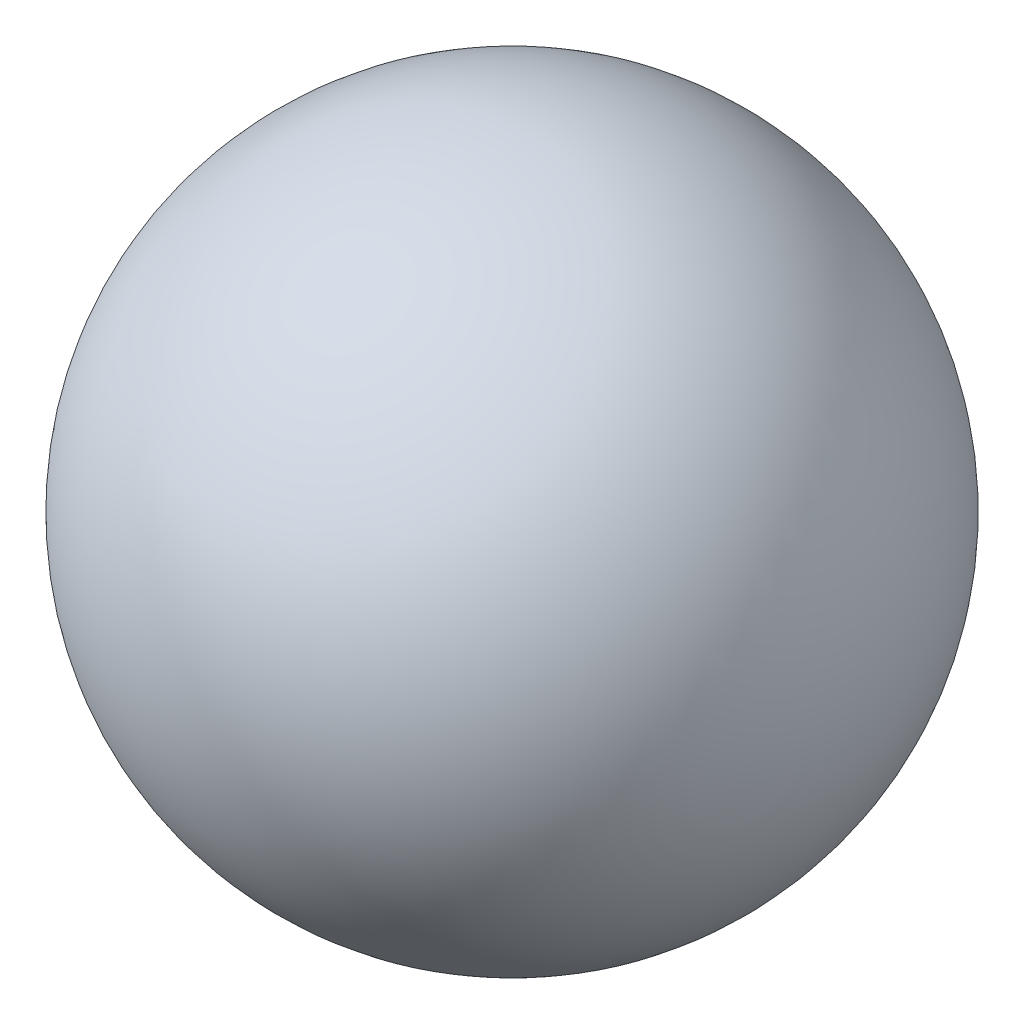
ISO-10303-21;
HEADER;
FILE_DESCRIPTION(('STEP AP214'),'2;1');
FILE_NAME('part.step','',(''),(''),'','','');
FILE_SCHEMA(('AUTOMOTIVE_DESIGN { 1 0 10303 214 1 1 1 1 }'));
ENDSEC;
DATA;
#1=APPLICATION_CONTEXT('core data for automotive mechanical design processes');
#2=APPLICATION_PROTOCOL_DEFINITION('international standard','automotive_design',2000,#1);
#3=PRODUCT_CONTEXT('',#1,'mechanical');
#4=PRODUCT('Part','Part','',(#3));
#5=PRODUCT_RELATED_PRODUCT_CATEGORY('part','',(#4));
#6=PRODUCT_DEFINITION_FORMATION('','',#4);
#7=PRODUCT_DEFINITION_CONTEXT('part definition',#1,'design');
#8=PRODUCT_DEFINITION('design','',#6,#7);
#9=PRODUCT_DEFINITION_SHAPE('','',#8);
#10=(LENGTH_UNIT() NAMED_UNIT(*) SI_UNIT(.MILLI.,.METRE.));
#11=(NAMED_UNIT(*) PLANE_ANGLE_UNIT() SI_UNIT($,.RADIAN.));
#12=(NAMED_UNIT(*) SI_UNIT($,.STERADIAN.) SOLID_ANGLE_UNIT());
#13=UNCERTAINTY_MEASURE_WITH_UNIT(LENGTH_MEASURE(1.E-05),#10,'distance_accuracy_value','');
#14=(GEOMETRIC_REPRESENTATION_CONTEXT(3) GLOBAL_UNCERTAINTY_ASSIGNED_CONTEXT((#13)) GLOBAL_UNIT_ASSIGNED_CONTEXT((#10,
#11,#12)) REPRESENTATION_CONTEXT('',''));
#15=CARTESIAN_POINT('',(0.,0.,0.));
#16=DIRECTION('',(0.,0.,1.));
#17=DIRECTION('',(1.,0.,0.));
#18=AXIS2_PLACEMENT_3D('',#15,#16,#17);
#19=CARTESIAN_POINT('',(0.,0.,0.));
#20=DIRECTION('',(0.,1.,0.));
#21=DIRECTION('',(1.,0.,0.));
#22=AXIS2_PLACEMENT_3D('',#19,#20,#21);
#23=SPHERICAL_SURFACE('',#22,3.86);
#24=CARTESIAN_POINT('',(0.,3.86,0.));
#25=VERTEX_POINT('',#24);
#26=VERTEX_LOOP('',#25);
#27=FACE_BOUND('',#26,.T.);
#28=ADVANCED_FACE('F41',(#27),#23,.T.);
#29=CLOSED_SHELL('',(#28));
#30=MANIFOLD_SOLID_BREP('B2',#29);
#31=ADVANCED_BREP_SHAPE_REPRESENTATION('',(#18,#30),#14);
#32=SHAPE_DEFINITION_REPRESENTATION(#9,#31);
ENDSEC;
END-ISO-10303-21;
